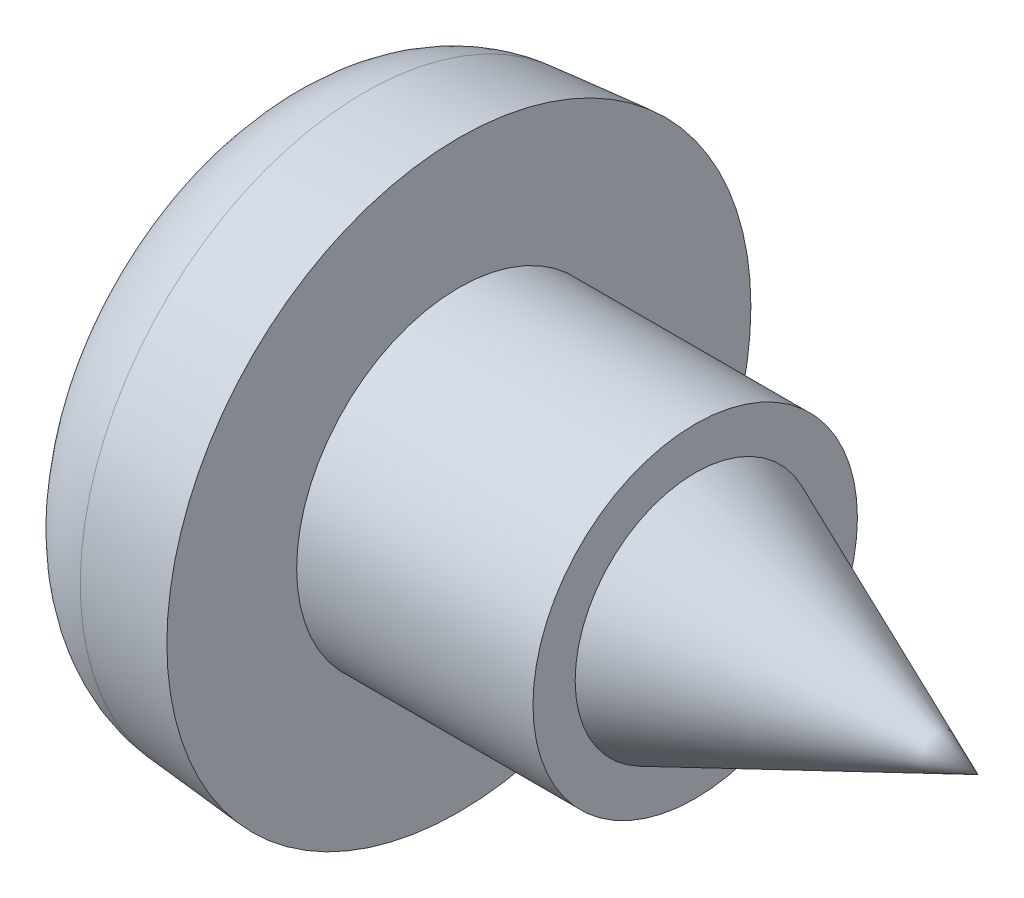
ISO-10303-21;
HEADER;
FILE_DESCRIPTION(('STEP AP214'),'2;1');
FILE_NAME('part.step','',(''),(''),'','','');
FILE_SCHEMA(('AUTOMOTIVE_DESIGN { 1 0 10303 214 1 1 1 1 }'));
ENDSEC;
DATA;
#1=APPLICATION_CONTEXT('core data for automotive mechanical design processes');
#2=APPLICATION_PROTOCOL_DEFINITION('international standard','automotive_design',2000,#1);
#3=PRODUCT_CONTEXT('',#1,'mechanical');
#4=PRODUCT('Part','Part','',(#3));
#5=PRODUCT_RELATED_PRODUCT_CATEGORY('part','',(#4));
#6=PRODUCT_DEFINITION_FORMATION('','',#4);
#7=PRODUCT_DEFINITION_CONTEXT('part definition',#1,'design');
#8=PRODUCT_DEFINITION('design','',#6,#7);
#9=PRODUCT_DEFINITION_SHAPE('','',#8);
#10=(LENGTH_UNIT() NAMED_UNIT(*) SI_UNIT(.MILLI.,.METRE.));
#11=(NAMED_UNIT(*) PLANE_ANGLE_UNIT() SI_UNIT($,.RADIAN.));
#12=(NAMED_UNIT(*) SI_UNIT($,.STERADIAN.) SOLID_ANGLE_UNIT());
#13=UNCERTAINTY_MEASURE_WITH_UNIT(LENGTH_MEASURE(1.E-05),#10,'distance_accuracy_value','');
#14=(GEOMETRIC_REPRESENTATION_CONTEXT(3) GLOBAL_UNCERTAINTY_ASSIGNED_CONTEXT((#13)) GLOBAL_UNIT_ASSIGNED_CONTEXT((#10,
#11,#12)) REPRESENTATION_CONTEXT('',''));
#15=CARTESIAN_POINT('',(0.,0.,0.));
#16=DIRECTION('',(0.,0.,1.));
#17=DIRECTION('',(1.,0.,0.));
#18=AXIS2_PLACEMENT_3D('',#15,#16,#17);
#19=CARTESIAN_POINT('',(8.71430910683078,0.,0.));
#20=DIRECTION('',(-1.,0.,0.));
#21=DIRECTION('',(0.,1.,0.));
#22=AXIS2_PLACEMENT_3D('',#19,#20,#21);
#23=SPHERICAL_SURFACE('',#22,12.0143091068308);
#24=CARTESIAN_POINT('',(-2.86461995912679,0.,0.));
#25=DIRECTION('',(-1.,0.,0.));
#26=DIRECTION('',(0.,-1.,0.));
#27=AXIS2_PLACEMENT_3D('',#24,#25,#26);
#28=CIRCLE('',#27,3.205);
#29=CARTESIAN_POINT('',(-2.86461995912679,-3.205,0.));
#30=VERTEX_POINT('',#29);
#31=EDGE_CURVE('E200',#30,#30,#28,.T.);
#32=ORIENTED_EDGE('',*,*,#31,.T.);
#33=EDGE_LOOP('',(#32));
#34=FACE_BOUND('',#33,.T.);
#35=CARTESIAN_POINT('',(8.71430910683078,0.,0.6));
#36=DIRECTION('',(0.,0.,-1.));
#37=DIRECTION('',(0.,1.,0.));
#38=AXIS2_PLACEMENT_3D('',#35,#36,#37);
#39=CIRCLE('',#38,11.9993176187014);
#40=CARTESIAN_POINT('',(-3.19088401694831,1.5,0.6));
#41=VERTEX_POINT('',#40);
#42=CARTESIAN_POINT('',(-3.03222754507122,2.45,0.6));
#43=VERTEX_POINT('',#42);
#44=EDGE_CURVE('E11',#41,#43,#39,.T.);
#45=ORIENTED_EDGE('',*,*,#44,.F.);
#46=CARTESIAN_POINT('',(-3.19085881503451,0.600000022222222,1.5002));
#47=CARTESIAN_POINT('',(-3.19717240021516,0.599944734246533,1.45014526895655));
#48=CARTESIAN_POINT('',(-3.20295251184894,0.604151437411233,1.40002361712067));
#49=CARTESIAN_POINT('',(-3.21330282557359,0.620840534157111,1.30106750971077));
#50=CARTESIAN_POINT('',(-3.21787345646741,0.633319989245332,1.25223260348464));
#51=CARTESIAN_POINT('',(-3.22566973273479,0.66632016780765,1.15719444171774));
#52=CARTESIAN_POINT('',(-3.2288942692566,0.686847493871419,1.11099338276246));
#53=CARTESIAN_POINT('',(-3.23389679913557,0.735372122855358,1.02262964181853));
#54=CARTESIAN_POINT('',(-3.23567528470542,0.763366879668487,0.980465590012011));
#55=CARTESIAN_POINT('',(-3.23772423786926,0.825776684300079,0.901731078441331));
#56=CARTESIAN_POINT('',(-3.2380072900193,0.860135627303679,0.865116466523264));
#57=CARTESIAN_POINT('',(-3.23709069611638,0.934451796124362,0.79810362632765));
#58=CARTESIAN_POINT('',(-3.23589083630782,0.974409828290752,0.767706294981509));
#59=CARTESIAN_POINT('',(-3.23205184363733,1.05860429914413,0.714091363648474));
#60=CARTESIAN_POINT('',(-3.2294180812834,1.10282426980992,0.690847476632724));
#61=CARTESIAN_POINT('',(-3.22279194359357,1.19440526484376,0.652012313699351));
#62=CARTESIAN_POINT('',(-3.2188000322867,1.24176521195475,0.636418428497995));
#63=CARTESIAN_POINT('',(-3.21089509556472,1.32447742653252,0.616568854951261));
#64=CARTESIAN_POINT('',(-3.20728437760876,1.35940133777345,0.610347785083807));
#65=CARTESIAN_POINT('',(-3.19948913356997,1.42962442311515,0.602058898418503));
#66=CARTESIAN_POINT('',(-3.19530543427538,1.46492299010207,0.599985163267821));
#67=CARTESIAN_POINT('',(-3.19085881503451,1.5002,0.600000022222223));
#68=B_SPLINE_CURVE_WITH_KNOTS('',3,(#46,#47,#48,#49,#50,#51,#52,#53,#54,#55,#56,#57,#58,#59,#60,
#61,#62,#63,#64,#65,#66,#67),.UNSPECIFIED.,.F.,.F.,(4,2,2,2,2,2,2,2,2,2,4),(0.,
0.151173776911939,0.302293885440135,0.45353823540821,0.604731082633738,0.754649542694306,
0.904589615400038,1.05397193090284,1.20330325918657,1.31003799133619,1.41662030129791),.UNSPECIFIED.);
#69=CARTESIAN_POINT('',(-3.19088401694831,0.6,1.5));
#70=VERTEX_POINT('',#69);
#71=EDGE_CURVE('E55',#70,#41,#68,.T.);
#72=ORIENTED_EDGE('',*,*,#71,.F.);
#73=CARTESIAN_POINT('',(8.71430910683078,0.6,0.));
#74=DIRECTION('',(0.,-1.,0.));
#75=DIRECTION('',(0.,0.,-1.));
#76=AXIS2_PLACEMENT_3D('',#73,#74,#75);
#77=CIRCLE('',#76,11.9993176187014);
#78=CARTESIAN_POINT('',(-3.03222754507122,0.6,2.45));
#79=VERTEX_POINT('',#78);
#80=EDGE_CURVE('E297',#79,#70,#77,.T.);
#81=ORIENTED_EDGE('',*,*,#80,.F.);
#82=CARTESIAN_POINT('',(8.71430910683078,0.,2.45));
#83=DIRECTION('',(0.,0.,-1.));
#84=DIRECTION('',(-1.,0.,0.));
#85=AXIS2_PLACEMENT_3D('',#82,#83,#84);
#86=CIRCLE('',#85,11.7618503354905);
#87=CARTESIAN_POINT('',(-3.03222754507122,-0.6,2.45));
#88=VERTEX_POINT('',#87);
#89=EDGE_CURVE('E298',#88,#79,#86,.T.);
#90=ORIENTED_EDGE('',*,*,#89,.F.);
#91=CARTESIAN_POINT('',(8.71430910683078,-0.600000000000002,0.));
#92=DIRECTION('',(0.,1.,0.));
#93=DIRECTION('',(0.,0.,1.));
#94=AXIS2_PLACEMENT_3D('',#91,#92,#93);
#95=CIRCLE('',#94,11.9993176187014);
#96=CARTESIAN_POINT('',(-3.19088401694831,-0.6,1.5));
#97=VERTEX_POINT('',#96);
#98=EDGE_CURVE('E267',#97,#88,#95,.T.);
#99=ORIENTED_EDGE('',*,*,#98,.F.);
#100=CARTESIAN_POINT('',(-3.19085881503451,-1.5002,0.600000022222223));
#101=CARTESIAN_POINT('',(-3.19717240021516,-1.45014526895655,0.599944734246533));
#102=CARTESIAN_POINT('',(-3.20295251184894,-1.40002361712067,0.604151437411234));
#103=CARTESIAN_POINT('',(-3.21330282557359,-1.30106750971077,0.620840534157112));
#104=CARTESIAN_POINT('',(-3.21787345646741,-1.25223260348464,0.633319989245333));
#105=CARTESIAN_POINT('',(-3.22566973273479,-1.15719444171774,0.666320167807651));
#106=CARTESIAN_POINT('',(-3.2288942692566,-1.11099338276246,0.68684749387142));
#107=CARTESIAN_POINT('',(-3.23389679913557,-1.02262964181853,0.735372122855359));
#108=CARTESIAN_POINT('',(-3.23567528470542,-0.980465590012011,0.763366879668488));
#109=CARTESIAN_POINT('',(-3.23772423786926,-0.901731078441331,0.82577668430008));
#110=CARTESIAN_POINT('',(-3.23800729001929,-0.865116466523264,0.86013562730368));
#111=CARTESIAN_POINT('',(-3.23709069611638,-0.79810362632765,0.934451796124363));
#112=CARTESIAN_POINT('',(-3.23589083630782,-0.767706294981509,0.974409828290753));
#113=CARTESIAN_POINT('',(-3.23205184363733,-0.714091363648474,1.05860429914413));
#114=CARTESIAN_POINT('',(-3.2294180812834,-0.690847476632724,1.10282426980993));
#115=CARTESIAN_POINT('',(-3.22279194359357,-0.652012313699351,1.19440526484376));
#116=CARTESIAN_POINT('',(-3.2188000322867,-0.636418428497995,1.24176521195475));
#117=CARTESIAN_POINT('',(-3.21089509556472,-0.616568854951261,1.32447742653252));
#118=CARTESIAN_POINT('',(-3.20728437760876,-0.610347785083807,1.35940133777345));
#119=CARTESIAN_POINT('',(-3.19948913356997,-0.602058898418503,1.42962442311515));
#120=CARTESIAN_POINT('',(-3.19530543427538,-0.599985163267821,1.46492299010207));
#121=CARTESIAN_POINT('',(-3.19085881503451,-0.600000022222223,1.5002));
#122=B_SPLINE_CURVE_WITH_KNOTS('',3,(#100,#101,#102,#103,#104,#105,#106,#107,#108,#109,#110,
#111,#112,#113,#114,#115,#116,#117,#118,#119,#120,#121),.UNSPECIFIED.,.F.,.F.,(4,2,2,2,2,2,2,2,
2,2,4),(0.,0.151173776911939,0.302293885440135,0.45353823540821,0.604731082633738,
0.754649542694306,0.904589615400038,1.05397193090284,1.20330325918657,1.31003799133619,
1.41662030129791),.UNSPECIFIED.);
#123=CARTESIAN_POINT('',(-3.19088401694831,-1.5,0.6));
#124=VERTEX_POINT('',#123);
#125=EDGE_CURVE('E260',#124,#97,#122,.T.);
#126=ORIENTED_EDGE('',*,*,#125,.F.);
#127=CARTESIAN_POINT('',(8.71430910683078,0.,0.6));
#128=DIRECTION('',(0.,0.,-1.));
#129=DIRECTION('',(0.,1.,0.));
#130=AXIS2_PLACEMENT_3D('',#127,#128,#129);
#131=CIRCLE('',#130,11.9993176187014);
#132=CARTESIAN_POINT('',(-3.03222754507122,-2.45,0.6));
#133=VERTEX_POINT('',#132);
#134=EDGE_CURVE('E258',#133,#124,#131,.T.);
#135=ORIENTED_EDGE('',*,*,#134,.F.);
#136=CARTESIAN_POINT('',(8.71430910683078,-2.45,0.));
#137=DIRECTION('',(0.,1.,0.));
#138=DIRECTION('',(0.,0.,1.));
#139=AXIS2_PLACEMENT_3D('',#136,#137,#138);
#140=CIRCLE('',#139,11.7618503354905);
#141=CARTESIAN_POINT('',(-3.03222754507122,-2.45,-0.600000000000001));
#142=VERTEX_POINT('',#141);
#143=EDGE_CURVE('E256',#142,#133,#140,.T.);
#144=ORIENTED_EDGE('',*,*,#143,.F.);
#145=CARTESIAN_POINT('',(8.71430910683078,0.,-0.599999999999999));
#146=DIRECTION('',(0.,0.,1.));
#147=DIRECTION('',(0.,-1.,0.));
#148=AXIS2_PLACEMENT_3D('',#145,#146,#147);
#149=CIRCLE('',#148,11.9993176187014);
#150=CARTESIAN_POINT('',(-3.19088401694831,-1.5,-0.6));
#151=VERTEX_POINT('',#150);
#152=EDGE_CURVE('E253',#151,#142,#149,.T.);
#153=ORIENTED_EDGE('',*,*,#152,.F.);
#154=CARTESIAN_POINT('',(-3.19085881503451,-0.600000022222223,-1.5002));
#155=CARTESIAN_POINT('',(-3.19717240021516,-0.599944734246533,-1.45014526895655));
#156=CARTESIAN_POINT('',(-3.20295251184894,-0.604151437411233,-1.40002361712067));
#157=CARTESIAN_POINT('',(-3.21330282557359,-0.620840534157112,-1.30106750971077));
#158=CARTESIAN_POINT('',(-3.21787345646741,-0.633319989245332,-1.25223260348464));
#159=CARTESIAN_POINT('',(-3.22566973273479,-0.666320167807651,-1.15719444171774));
#160=CARTESIAN_POINT('',(-3.2288942692566,-0.686847493871419,-1.11099338276246));
#161=CARTESIAN_POINT('',(-3.23389679913557,-0.735372122855358,-1.02262964181853));
#162=CARTESIAN_POINT('',(-3.23567528470542,-0.763366879668487,-0.980465590012011));
#163=CARTESIAN_POINT('',(-3.23772423786926,-0.825776684300079,-0.901731078441332));
#164=CARTESIAN_POINT('',(-3.2380072900193,-0.86013562730368,-0.865116466523265));
#165=CARTESIAN_POINT('',(-3.23709069611638,-0.934451796124362,-0.79810362632765));
#166=CARTESIAN_POINT('',(-3.23589083630782,-0.974409828290752,-0.767706294981509));
#167=CARTESIAN_POINT('',(-3.23205184363733,-1.05860429914413,-0.714091363648474));
#168=CARTESIAN_POINT('',(-3.2294180812834,-1.10282426980992,-0.690847476632724));
#169=CARTESIAN_POINT('',(-3.22279194359357,-1.19440526484376,-0.652012313699351));
#170=CARTESIAN_POINT('',(-3.2188000322867,-1.24176521195475,-0.636418428497995));
#171=CARTESIAN_POINT('',(-3.21089509556472,-1.32447742653252,-0.616568854951261));
#172=CARTESIAN_POINT('',(-3.20728437760876,-1.35940133777345,-0.610347785083807));
#173=CARTESIAN_POINT('',(-3.19948913356997,-1.42962442311515,-0.602058898418503));
#174=CARTESIAN_POINT('',(-3.19530543427538,-1.46492299010207,-0.599985163267821));
#175=CARTESIAN_POINT('',(-3.19085881503451,-1.5002,-0.600000022222223));
#176=B_SPLINE_CURVE_WITH_KNOTS('',3,(#154,#155,#156,#157,#158,#159,#160,#161,#162,#163,#164,
#165,#166,#167,#168,#169,#170,#171,#172,#173,#174,#175),.UNSPECIFIED.,.F.,.F.,(4,2,2,2,2,2,2,2,
2,2,4),(0.,0.151173776911938,0.302293885440135,0.45353823540821,0.604731082633738,
0.754649542694306,0.904589615400038,1.05397193090284,1.20330325918657,1.31003799133619,
1.41662030129791),.UNSPECIFIED.);
#177=CARTESIAN_POINT('',(-3.19088401694831,-0.600000000000001,-1.5));
#178=VERTEX_POINT('',#177);
#179=EDGE_CURVE('E246',#178,#151,#176,.T.);
#180=ORIENTED_EDGE('',*,*,#179,.F.);
#181=CARTESIAN_POINT('',(8.71430910683078,-0.600000000000001,0.));
#182=DIRECTION('',(0.,1.,0.));
#183=DIRECTION('',(0.,0.,1.));
#184=AXIS2_PLACEMENT_3D('',#181,#182,#183);
#185=CIRCLE('',#184,11.9993176187014);
#186=CARTESIAN_POINT('',(-3.03222754507122,-0.6,-2.45));
#187=VERTEX_POINT('',#186);
#188=EDGE_CURVE('E254',#187,#178,#185,.T.);
#189=ORIENTED_EDGE('',*,*,#188,.F.);
#190=CARTESIAN_POINT('',(8.71430910683078,0.,-2.45));
#191=DIRECTION('',(0.,0.,1.));
#192=DIRECTION('',(1.,0.,0.));
#193=AXIS2_PLACEMENT_3D('',#190,#191,#192);
#194=CIRCLE('',#193,11.7618503354905);
#195=CARTESIAN_POINT('',(-3.03222754507122,0.6,-2.45));
#196=VERTEX_POINT('',#195);
#197=EDGE_CURVE('E398',#196,#187,#194,.T.);
#198=ORIENTED_EDGE('',*,*,#197,.F.);
#199=CARTESIAN_POINT('',(8.71430910683078,0.600000000000001,0.));
#200=DIRECTION('',(0.,-1.,0.));
#201=DIRECTION('',(0.,0.,-1.));
#202=AXIS2_PLACEMENT_3D('',#199,#200,#201);
#203=CIRCLE('',#202,11.9993176187014);
#204=CARTESIAN_POINT('',(-3.19088401694831,0.6,-1.5));
#205=VERTEX_POINT('',#204);
#206=EDGE_CURVE('E214',#205,#196,#203,.T.);
#207=ORIENTED_EDGE('',*,*,#206,.F.);
#208=CARTESIAN_POINT('',(-3.19085881503451,1.5002,-0.600000022222223));
#209=CARTESIAN_POINT('',(-3.19717240021516,1.45014526895655,-0.599944734246533));
#210=CARTESIAN_POINT('',(-3.20295251184894,1.40002361712067,-0.604151437411233));
#211=CARTESIAN_POINT('',(-3.21330282557359,1.30106750971077,-0.620840534157112));
#212=CARTESIAN_POINT('',(-3.21787345646741,1.25223260348464,-0.633319989245332));
#213=CARTESIAN_POINT('',(-3.22566973273479,1.15719444171774,-0.666320167807651));
#214=CARTESIAN_POINT('',(-3.2288942692566,1.11099338276246,-0.686847493871419));
#215=CARTESIAN_POINT('',(-3.23389679913557,1.02262964181853,-0.735372122855358));
#216=CARTESIAN_POINT('',(-3.23567528470542,0.980465590012011,-0.763366879668487));
#217=CARTESIAN_POINT('',(-3.23772423786926,0.901731078441331,-0.82577668430008));
#218=CARTESIAN_POINT('',(-3.2380072900193,0.865116466523264,-0.86013562730368));
#219=CARTESIAN_POINT('',(-3.23709069611638,0.798103626327649,-0.934451796124363));
#220=CARTESIAN_POINT('',(-3.23589083630782,0.767706294981509,-0.974409828290753));
#221=CARTESIAN_POINT('',(-3.23205184363733,0.714091363648473,-1.05860429914413));
#222=CARTESIAN_POINT('',(-3.2294180812834,0.690847476632723,-1.10282426980993));
#223=CARTESIAN_POINT('',(-3.22279194359357,0.65201231369935,-1.19440526484376));
#224=CARTESIAN_POINT('',(-3.2188000322867,0.636418428497995,-1.24176521195475));
#225=CARTESIAN_POINT('',(-3.21089509556472,0.616568854951261,-1.32447742653253));
#226=CARTESIAN_POINT('',(-3.20728437760876,0.610347785083807,-1.35940133777346));
#227=CARTESIAN_POINT('',(-3.19948913356997,0.602058898418503,-1.42962442311515));
#228=CARTESIAN_POINT('',(-3.19530543427538,0.599985163267821,-1.46492299010207));
#229=CARTESIAN_POINT('',(-3.19085881503451,0.600000022222223,-1.5002));
#230=B_SPLINE_CURVE_WITH_KNOTS('',3,(#208,#209,#210,#211,#212,#213,#214,#215,#216,#217,#218,
#219,#220,#221,#222,#223,#224,#225,#226,#227,#228,#229),.UNSPECIFIED.,.F.,.F.,(4,2,2,2,2,2,2,2,
2,2,4),(0.,0.151173776911939,0.302293885440135,0.45353823540821,0.604731082633739,
0.754649542694306,0.904589615400038,1.05397193090284,1.20330325918657,1.31003799133619,
1.41662030129791),.UNSPECIFIED.);
#231=CARTESIAN_POINT('',(-3.19088401694831,1.5,-0.6));
#232=VERTEX_POINT('',#231);
#233=EDGE_CURVE('E207',#232,#205,#230,.T.);
#234=ORIENTED_EDGE('',*,*,#233,.F.);
#235=CARTESIAN_POINT('',(8.71430910683078,0.,-0.6));
#236=DIRECTION('',(0.,0.,1.));
#237=DIRECTION('',(0.,-1.,0.));
#238=AXIS2_PLACEMENT_3D('',#235,#236,#237);
#239=CIRCLE('',#238,11.9993176187014);
#240=CARTESIAN_POINT('',(-3.03222754507122,2.45,-0.6));
#241=VERTEX_POINT('',#240);
#242=EDGE_CURVE('E205',#241,#232,#239,.T.);
#243=ORIENTED_EDGE('',*,*,#242,.F.);
#244=CARTESIAN_POINT('',(8.71430910683078,2.45,0.));
#245=DIRECTION('',(0.,-1.,0.));
#246=DIRECTION('',(0.,0.,-1.));
#247=AXIS2_PLACEMENT_3D('',#244,#245,#246);
#248=CIRCLE('',#247,11.7618503354905);
#249=EDGE_CURVE('E203',#43,#241,#248,.T.);
#250=ORIENTED_EDGE('',*,*,#249,.F.);
#251=EDGE_LOOP('',(#45,#72,#81,#90,#99,#126,#135,#144,#153,#180,#189,#198,#207,#234,#243,#250));
#252=FACE_BOUND('',#251,.T.);
#253=ADVANCED_FACE('F47',(#34,#252),#23,.T.);
#254=CARTESIAN_POINT('',(-1.32260149258019,0.,0.));
#255=DIRECTION('',(-1.,0.,0.));
#256=DIRECTION('',(0.,-1.,0.));
#257=AXIS2_PLACEMENT_3D('',#254,#255,#256);
#258=TOROIDAL_SURFACE('',#257,2.77817562296741,1.6);
#259=ORIENTED_EDGE('',*,*,#31,.F.);
#260=EDGE_LOOP('',(#259));
#261=FACE_BOUND('',#260,.T.);
#262=CARTESIAN_POINT('',(-1.46205068097644,0.,0.));
#263=DIRECTION('',(-1.,0.,0.));
#264=DIRECTION('',(0.,-1.,0.));
#265=AXIS2_PLACEMENT_3D('',#262,#263,#264);
#266=CIRCLE('',#265,4.3720871399142);
#267=CARTESIAN_POINT('',(-1.46205068097644,-4.3720871399142,0.));
#268=VERTEX_POINT('',#267);
#269=EDGE_CURVE('E179',#268,#268,#266,.T.);
#270=ORIENTED_EDGE('',*,*,#269,.T.);
#271=EDGE_LOOP('',(#270));
#272=FACE_BOUND('',#271,.T.);
#273=ADVANCED_FACE('F49',(#261,#272),#258,.T.);
#274=CARTESIAN_POINT('',(8.,0.,0.));
#275=DIRECTION('',(-1.,0.,0.));
#276=DIRECTION('',(0.,-1.,0.));
#277=AXIS2_PLACEMENT_3D('',#274,#275,#276);
#278=CONICAL_SURFACE('',#277,0.,0.401425727958697);
#279=CARTESIAN_POINT('',(3.64167312322607,0.,0.));
#280=DIRECTION('',(-1.,0.,0.));
#281=DIRECTION('',(0.,-1.,0.));
#282=AXIS2_PLACEMENT_3D('',#279,#280,#281);
#283=CIRCLE('',#282,1.85);
#284=CARTESIAN_POINT('',(3.64167312322607,-1.85,0.));
#285=VERTEX_POINT('',#284);
#286=EDGE_CURVE('E197',#285,#285,#283,.T.);
#287=ORIENTED_EDGE('',*,*,#286,.F.);
#288=EDGE_LOOP('',(#287));
#289=FACE_BOUND('',#288,.T.);
#290=CARTESIAN_POINT('',(8.,0.,0.));
#291=VERTEX_POINT('',#290);
#292=VERTEX_LOOP('',#291);
#293=FACE_BOUND('',#292,.T.);
#294=ADVANCED_FACE('F423',(#289,#293),#278,.T.);
#295=CARTESIAN_POINT('',(3.64167312322607,2.5,0.));
#296=DIRECTION('',(-1.,0.,0.));
#297=DIRECTION('',(0.,-1.,0.));
#298=AXIS2_PLACEMENT_3D('',#295,#296,#297);
#299=PLANE('',#298);
#300=CARTESIAN_POINT('',(3.64167312322607,0.,0.));
#301=DIRECTION('',(-1.,0.,0.));
#302=DIRECTION('',(0.,-1.,0.));
#303=AXIS2_PLACEMENT_3D('',#300,#301,#302);
#304=CIRCLE('',#303,2.5);
#305=CARTESIAN_POINT('',(3.64167312322607,-2.5,0.));
#306=VERTEX_POINT('',#305);
#307=EDGE_CURVE('E194',#306,#306,#304,.T.);
#308=ORIENTED_EDGE('',*,*,#307,.F.);
#309=EDGE_LOOP('',(#308));
#310=FACE_BOUND('',#309,.T.);
#311=ORIENTED_EDGE('',*,*,#286,.T.);
#312=EDGE_LOOP('',(#311));
#313=FACE_BOUND('',#312,.T.);
#314=ADVANCED_FACE('F442',(#310,#313),#299,.F.);
#315=CARTESIAN_POINT('',(-3.3,0.,0.));
#316=DIRECTION('',(-1.,0.,0.));
#317=DIRECTION('',(0.,-1.,0.));
#318=AXIS2_PLACEMENT_3D('',#315,#316,#317);
#319=CYLINDRICAL_SURFACE('',#318,2.5);
#320=CARTESIAN_POINT('',(0.,0.,0.));
#321=DIRECTION('',(-1.,0.,0.));
#322=DIRECTION('',(0.,-1.,0.));
#323=AXIS2_PLACEMENT_3D('',#320,#321,#322);
#324=CIRCLE('',#323,2.5);
#325=CARTESIAN_POINT('',(0.,-2.5,0.));
#326=VERTEX_POINT('',#325);
#327=EDGE_CURVE('E191',#326,#326,#324,.T.);
#328=ORIENTED_EDGE('',*,*,#327,.F.);
#329=EDGE_LOOP('',(#328));
#330=FACE_BOUND('',#329,.T.);
#331=ORIENTED_EDGE('',*,*,#307,.T.);
#332=EDGE_LOOP('',(#331));
#333=FACE_BOUND('',#332,.T.);
#334=ADVANCED_FACE('F436',(#330,#333),#319,.T.);
#335=CARTESIAN_POINT('',(0.,4.5,0.));
#336=DIRECTION('',(-1.,0.,0.));
#337=DIRECTION('',(0.,-1.,0.));
#338=AXIS2_PLACEMENT_3D('',#335,#336,#337);
#339=PLANE('',#338);
#340=CARTESIAN_POINT('',(0.,0.,0.));
#341=DIRECTION('',(-1.,0.,0.));
#342=DIRECTION('',(0.,-1.,0.));
#343=AXIS2_PLACEMENT_3D('',#340,#341,#342);
#344=CIRCLE('',#343,4.5);
#345=CARTESIAN_POINT('',(0.,-4.5,0.));
#346=VERTEX_POINT('',#345);
#347=EDGE_CURVE('E183',#346,#346,#344,.T.);
#348=ORIENTED_EDGE('',*,*,#347,.F.);
#349=EDGE_LOOP('',(#348));
#350=FACE_BOUND('',#349,.T.);
#351=ORIENTED_EDGE('',*,*,#327,.T.);
#352=EDGE_LOOP('',(#351));
#353=FACE_BOUND('',#352,.T.);
#354=ADVANCED_FACE('F431',(#350,#353),#339,.F.);
#355=CARTESIAN_POINT('',(0.,0.,0.));
#356=DIRECTION('',(1.,0.,0.));
#357=DIRECTION('',(0.,1.,0.));
#358=AXIS2_PLACEMENT_3D('',#355,#356,#357);
#359=CONICAL_SURFACE('',#358,4.5,0.0872664625997173);
#360=ORIENTED_EDGE('',*,*,#269,.F.);
#361=EDGE_LOOP('',(#360));
#362=FACE_BOUND('',#361,.T.);
#363=ORIENTED_EDGE('',*,*,#347,.T.);
#364=EDGE_LOOP('',(#363));
#365=FACE_BOUND('',#364,.T.);
#366=ADVANCED_FACE('F429',(#362,#365),#359,.T.);
#367=CARTESIAN_POINT('',(-1.65,1.5,0.6));
#368=DIRECTION('',(0.,0.,-1.));
#369=DIRECTION('',(0.,1.,0.));
#370=AXIS2_PLACEMENT_3D('',#367,#368,#369);
#371=PLANE('',#370);
#372=ORIENTED_EDGE('',*,*,#44,.T.);
#373=DIRECTION('',(-1.,0.,0.));
#374=VECTOR('',#373,1.);
#375=CARTESIAN_POINT('',(-1.65,2.45,0.6));
#376=LINE('',#375,#374);
#377=CARTESIAN_POINT('',(-1.65,2.45,0.6));
#378=VERTEX_POINT('',#377);
#379=EDGE_CURVE('E62',#378,#43,#376,.T.);
#380=ORIENTED_EDGE('',*,*,#379,.F.);
#381=DIRECTION('',(0.,-1.,0.));
#382=VECTOR('',#381,1.);
#383=CARTESIAN_POINT('',(-1.65,1.5,0.6));
#384=LINE('',#383,#382);
#385=CARTESIAN_POINT('',(-1.65,1.5,0.6));
#386=VERTEX_POINT('',#385);
#387=EDGE_CURVE('E163',#378,#386,#384,.T.);
#388=ORIENTED_EDGE('',*,*,#387,.T.);
#389=DIRECTION('',(-1.,0.,0.));
#390=VECTOR('',#389,1.);
#391=CARTESIAN_POINT('',(-1.65,1.5,0.6));
#392=LINE('',#391,#390);
#393=EDGE_CURVE('E174',#386,#41,#392,.T.);
#394=ORIENTED_EDGE('',*,*,#393,.T.);
#395=EDGE_LOOP('',(#372,#380,#388,#394));
#396=FACE_BOUND('',#395,.T.);
#397=ADVANCED_FACE('F173',(#396),#371,.T.);
#398=CARTESIAN_POINT('',(-1.65,1.5,1.5));
#399=DIRECTION('',(-1.,0.,0.));
#400=DIRECTION('',(0.,0.,1.));
#401=AXIS2_PLACEMENT_3D('',#398,#399,#400);
#402=CYLINDRICAL_SURFACE('',#401,0.9);
#403=ORIENTED_EDGE('',*,*,#71,.T.);
#404=ORIENTED_EDGE('',*,*,#393,.F.);
#405=CARTESIAN_POINT('',(-1.65,1.5,1.5));
#406=DIRECTION('',(-1.,0.,0.));
#407=DIRECTION('',(0.,0.,-1.));
#408=AXIS2_PLACEMENT_3D('',#405,#406,#407);
#409=CIRCLE('',#408,0.9);
#410=CARTESIAN_POINT('',(-1.65,0.6,1.5));
#411=VERTEX_POINT('',#410);
#412=EDGE_CURVE('E159',#386,#411,#409,.T.);
#413=ORIENTED_EDGE('',*,*,#412,.T.);
#414=DIRECTION('',(-1.,0.,0.));
#415=VECTOR('',#414,1.);
#416=CARTESIAN_POINT('',(-1.65,0.6,1.5));
#417=LINE('',#416,#415);
#418=EDGE_CURVE('E180',#411,#70,#417,.T.);
#419=ORIENTED_EDGE('',*,*,#418,.T.);
#420=EDGE_LOOP('',(#403,#404,#413,#419));
#421=FACE_BOUND('',#420,.T.);
#422=ADVANCED_FACE('F177',(#421),#402,.T.);
#423=CARTESIAN_POINT('',(-1.65,0.6,1.5));
#424=DIRECTION('',(0.,-1.,0.));
#425=DIRECTION('',(0.,0.,-1.));
#426=AXIS2_PLACEMENT_3D('',#423,#424,#425);
#427=PLANE('',#426);
#428=ORIENTED_EDGE('',*,*,#80,.T.);
#429=ORIENTED_EDGE('',*,*,#418,.F.);
#430=DIRECTION('',(0.,0.,1.));
#431=VECTOR('',#430,1.);
#432=CARTESIAN_POINT('',(-1.65,0.6,1.5));
#433=LINE('',#432,#431);
#434=CARTESIAN_POINT('',(-1.65,0.6,2.45));
#435=VERTEX_POINT('',#434);
#436=EDGE_CURVE('E165',#411,#435,#433,.T.);
#437=ORIENTED_EDGE('',*,*,#436,.T.);
#438=DIRECTION('',(-1.,0.,0.));
#439=VECTOR('',#438,1.);
#440=CARTESIAN_POINT('',(-1.65,0.6,2.45));
#441=LINE('',#440,#439);
#442=EDGE_CURVE('E185',#435,#79,#441,.T.);
#443=ORIENTED_EDGE('',*,*,#442,.T.);
#444=EDGE_LOOP('',(#428,#429,#437,#443));
#445=FACE_BOUND('',#444,.T.);
#446=ADVANCED_FACE('F283',(#445),#427,.T.);
#447=CARTESIAN_POINT('',(-1.65,0.6,2.45));
#448=DIRECTION('',(0.,0.,-1.));
#449=DIRECTION('',(-1.,0.,0.));
#450=AXIS2_PLACEMENT_3D('',#447,#448,#449);
#451=PLANE('',#450);
#452=ORIENTED_EDGE('',*,*,#89,.T.);
#453=ORIENTED_EDGE('',*,*,#442,.F.);
#454=DIRECTION('',(0.,-1.,0.));
#455=VECTOR('',#454,1.);
#456=CARTESIAN_POINT('',(-1.65,0.6,2.45));
#457=LINE('',#456,#455);
#458=CARTESIAN_POINT('',(-1.65,-0.6,2.45));
#459=VERTEX_POINT('',#458);
#460=EDGE_CURVE('E312',#435,#459,#457,.T.);
#461=ORIENTED_EDGE('',*,*,#460,.T.);
#462=DIRECTION('',(-1.,0.,0.));
#463=VECTOR('',#462,1.);
#464=CARTESIAN_POINT('',(-1.65,-0.6,2.45));
#465=LINE('',#464,#463);
#466=EDGE_CURVE('E306',#459,#88,#465,.T.);
#467=ORIENTED_EDGE('',*,*,#466,.T.);
#468=EDGE_LOOP('',(#452,#453,#461,#467));
#469=FACE_BOUND('',#468,.T.);
#470=ADVANCED_FACE('F279',(#469),#451,.T.);
#471=CARTESIAN_POINT('',(-1.65,-0.600000000000001,1.5));
#472=DIRECTION('',(0.,1.,0.));
#473=DIRECTION('',(0.,0.,1.));
#474=AXIS2_PLACEMENT_3D('',#471,#472,#473);
#475=PLANE('',#474);
#476=ORIENTED_EDGE('',*,*,#98,.T.);
#477=ORIENTED_EDGE('',*,*,#466,.F.);
#478=DIRECTION('',(0.,0.,-1.));
#479=VECTOR('',#478,1.);
#480=CARTESIAN_POINT('',(-1.65,-0.600000000000001,1.5));
#481=LINE('',#480,#479);
#482=CARTESIAN_POINT('',(-1.65,-0.6,1.5));
#483=VERTEX_POINT('',#482);
#484=EDGE_CURVE('E370',#459,#483,#481,.T.);
#485=ORIENTED_EDGE('',*,*,#484,.T.);
#486=DIRECTION('',(-1.,0.,0.));
#487=VECTOR('',#486,1.);
#488=CARTESIAN_POINT('',(-1.65,-0.6,1.5));
#489=LINE('',#488,#487);
#490=EDGE_CURVE('E309',#483,#97,#489,.T.);
#491=ORIENTED_EDGE('',*,*,#490,.T.);
#492=EDGE_LOOP('',(#476,#477,#485,#491));
#493=FACE_BOUND('',#492,.T.);
#494=ADVANCED_FACE('F275',(#493),#475,.T.);
#495=CARTESIAN_POINT('',(-1.65,-1.5,1.5));
#496=DIRECTION('',(-1.,0.,0.));
#497=DIRECTION('',(0.,0.,1.));
#498=AXIS2_PLACEMENT_3D('',#495,#496,#497);
#499=CYLINDRICAL_SURFACE('',#498,0.9);
#500=ORIENTED_EDGE('',*,*,#125,.T.);
#501=ORIENTED_EDGE('',*,*,#490,.F.);
#502=CARTESIAN_POINT('',(-1.65,-1.5,1.5));
#503=DIRECTION('',(-1.,0.,0.));
#504=DIRECTION('',(0.,0.,1.));
#505=AXIS2_PLACEMENT_3D('',#502,#503,#504);
#506=CIRCLE('',#505,0.9);
#507=CARTESIAN_POINT('',(-1.65,-1.5,0.6));
#508=VERTEX_POINT('',#507);
#509=EDGE_CURVE('E368',#483,#508,#506,.T.);
#510=ORIENTED_EDGE('',*,*,#509,.T.);
#511=DIRECTION('',(-1.,0.,0.));
#512=VECTOR('',#511,1.);
#513=CARTESIAN_POINT('',(-1.65,-1.5,0.6));
#514=LINE('',#513,#512);
#515=EDGE_CURVE('E317',#508,#124,#514,.T.);
#516=ORIENTED_EDGE('',*,*,#515,.T.);
#517=EDGE_LOOP('',(#500,#501,#510,#516));
#518=FACE_BOUND('',#517,.T.);
#519=ADVANCED_FACE('F269',(#518),#499,.T.);
#520=CARTESIAN_POINT('',(-1.65,-1.5,0.6));
#521=DIRECTION('',(0.,0.,-1.));
#522=DIRECTION('',(0.,1.,0.));
#523=AXIS2_PLACEMENT_3D('',#520,#521,#522);
#524=PLANE('',#523);
#525=ORIENTED_EDGE('',*,*,#134,.T.);
#526=ORIENTED_EDGE('',*,*,#515,.F.);
#527=DIRECTION('',(0.,-1.,0.));
#528=VECTOR('',#527,1.);
#529=CARTESIAN_POINT('',(-1.65,-1.5,0.6));
#530=LINE('',#529,#528);
#531=CARTESIAN_POINT('',(-1.65,-2.45,0.6));
#532=VERTEX_POINT('',#531);
#533=EDGE_CURVE('E366',#508,#532,#530,.T.);
#534=ORIENTED_EDGE('',*,*,#533,.T.);
#535=DIRECTION('',(-1.,0.,0.));
#536=VECTOR('',#535,1.);
#537=CARTESIAN_POINT('',(-1.65,-2.45,0.6));
#538=LINE('',#537,#536);
#539=EDGE_CURVE('E320',#532,#133,#538,.T.);
#540=ORIENTED_EDGE('',*,*,#539,.T.);
#541=EDGE_LOOP('',(#525,#526,#534,#540));
#542=FACE_BOUND('',#541,.T.);
#543=ADVANCED_FACE('F274',(#542),#524,.T.);
#544=CARTESIAN_POINT('',(-1.65,-2.45,-0.600000000000001));
#545=DIRECTION('',(0.,1.,0.));
#546=DIRECTION('',(0.,0.,1.));
#547=AXIS2_PLACEMENT_3D('',#544,#545,#546);
#548=PLANE('',#547);
#549=ORIENTED_EDGE('',*,*,#143,.T.);
#550=ORIENTED_EDGE('',*,*,#539,.F.);
#551=DIRECTION('',(0.,0.,-1.));
#552=VECTOR('',#551,1.);
#553=CARTESIAN_POINT('',(-1.65,-2.45,-0.600000000000001));
#554=LINE('',#553,#552);
#555=CARTESIAN_POINT('',(-1.65,-2.45,-0.600000000000001));
#556=VERTEX_POINT('',#555);
#557=EDGE_CURVE('E364',#532,#556,#554,.T.);
#558=ORIENTED_EDGE('',*,*,#557,.T.);
#559=DIRECTION('',(-1.,0.,0.));
#560=VECTOR('',#559,1.);
#561=CARTESIAN_POINT('',(-1.65,-2.45,-0.600000000000001));
#562=LINE('',#561,#560);
#563=EDGE_CURVE('E323',#556,#142,#562,.T.);
#564=ORIENTED_EDGE('',*,*,#563,.T.);
#565=EDGE_LOOP('',(#549,#550,#558,#564));
#566=FACE_BOUND('',#565,.T.);
#567=ADVANCED_FACE('F382',(#566),#548,.T.);
#568=CARTESIAN_POINT('',(-1.65,-1.5,-0.6));
#569=DIRECTION('',(0.,0.,1.));
#570=DIRECTION('',(0.,-1.,0.));
#571=AXIS2_PLACEMENT_3D('',#568,#569,#570);
#572=PLANE('',#571);
#573=ORIENTED_EDGE('',*,*,#152,.T.);
#574=ORIENTED_EDGE('',*,*,#563,.F.);
#575=DIRECTION('',(0.,1.,0.));
#576=VECTOR('',#575,1.);
#577=CARTESIAN_POINT('',(-1.65,-1.5,-0.6));
#578=LINE('',#577,#576);
#579=CARTESIAN_POINT('',(-1.65,-1.5,-0.6));
#580=VERTEX_POINT('',#579);
#581=EDGE_CURVE('E362',#556,#580,#578,.T.);
#582=ORIENTED_EDGE('',*,*,#581,.T.);
#583=DIRECTION('',(-1.,0.,0.));
#584=VECTOR('',#583,1.);
#585=CARTESIAN_POINT('',(-1.65,-1.5,-0.6));
#586=LINE('',#585,#584);
#587=EDGE_CURVE('E326',#580,#151,#586,.T.);
#588=ORIENTED_EDGE('',*,*,#587,.T.);
#589=EDGE_LOOP('',(#573,#574,#582,#588));
#590=FACE_BOUND('',#589,.T.);
#591=ADVANCED_FACE('F242',(#590),#572,.T.);
#592=CARTESIAN_POINT('',(-1.65,-1.5,-1.5));
#593=DIRECTION('',(-1.,0.,0.));
#594=DIRECTION('',(0.,0.,1.));
#595=AXIS2_PLACEMENT_3D('',#592,#593,#594);
#596=CYLINDRICAL_SURFACE('',#595,0.9);
#597=ORIENTED_EDGE('',*,*,#179,.T.);
#598=ORIENTED_EDGE('',*,*,#587,.F.);
#599=CARTESIAN_POINT('',(-1.65,-1.5,-1.5));
#600=DIRECTION('',(-1.,0.,0.));
#601=DIRECTION('',(0.,0.,1.));
#602=AXIS2_PLACEMENT_3D('',#599,#600,#601);
#603=CIRCLE('',#602,0.9);
#604=CARTESIAN_POINT('',(-1.65,-0.600000000000001,-1.5));
#605=VERTEX_POINT('',#604);
#606=EDGE_CURVE('E360',#580,#605,#603,.T.);
#607=ORIENTED_EDGE('',*,*,#606,.T.);
#608=DIRECTION('',(-1.,0.,0.));
#609=VECTOR('',#608,1.);
#610=CARTESIAN_POINT('',(-1.65,-0.600000000000001,-1.5));
#611=LINE('',#610,#609);
#612=EDGE_CURVE('E329',#605,#178,#611,.T.);
#613=ORIENTED_EDGE('',*,*,#612,.T.);
#614=EDGE_LOOP('',(#597,#598,#607,#613));
#615=FACE_BOUND('',#614,.T.);
#616=ADVANCED_FACE('F237',(#615),#596,.T.);
#617=CARTESIAN_POINT('',(-1.65,-0.6,-2.45));
#618=DIRECTION('',(0.,1.,0.));
#619=DIRECTION('',(0.,0.,1.));
#620=AXIS2_PLACEMENT_3D('',#617,#618,#619);
#621=PLANE('',#620);
#622=ORIENTED_EDGE('',*,*,#188,.T.);
#623=ORIENTED_EDGE('',*,*,#612,.F.);
#624=DIRECTION('',(0.,0.,-1.));
#625=VECTOR('',#624,1.);
#626=CARTESIAN_POINT('',(-1.65,-0.6,-2.45));
#627=LINE('',#626,#625);
#628=CARTESIAN_POINT('',(-1.65,-0.6,-2.45));
#629=VERTEX_POINT('',#628);
#630=EDGE_CURVE('E358',#605,#629,#627,.T.);
#631=ORIENTED_EDGE('',*,*,#630,.T.);
#632=DIRECTION('',(-1.,0.,0.));
#633=VECTOR('',#632,1.);
#634=CARTESIAN_POINT('',(-1.65,-0.6,-2.45));
#635=LINE('',#634,#633);
#636=EDGE_CURVE('E332',#629,#187,#635,.T.);
#637=ORIENTED_EDGE('',*,*,#636,.T.);
#638=EDGE_LOOP('',(#622,#623,#631,#637));
#639=FACE_BOUND('',#638,.T.);
#640=ADVANCED_FACE('F233',(#639),#621,.T.);
#641=CARTESIAN_POINT('',(-1.65,0.6,-2.45));
#642=DIRECTION('',(0.,0.,1.));
#643=DIRECTION('',(1.,0.,0.));
#644=AXIS2_PLACEMENT_3D('',#641,#642,#643);
#645=PLANE('',#644);
#646=ORIENTED_EDGE('',*,*,#197,.T.);
#647=ORIENTED_EDGE('',*,*,#636,.F.);
#648=DIRECTION('',(0.,1.,0.));
#649=VECTOR('',#648,1.);
#650=CARTESIAN_POINT('',(-1.65,0.6,-2.45));
#651=LINE('',#650,#649);
#652=CARTESIAN_POINT('',(-1.65,0.6,-2.45));
#653=VERTEX_POINT('',#652);
#654=EDGE_CURVE('E356',#629,#653,#651,.T.);
#655=ORIENTED_EDGE('',*,*,#654,.T.);
#656=DIRECTION('',(-1.,0.,0.));
#657=VECTOR('',#656,1.);
#658=CARTESIAN_POINT('',(-1.65,0.6,-2.45));
#659=LINE('',#658,#657);
#660=EDGE_CURVE('E335',#653,#196,#659,.T.);
#661=ORIENTED_EDGE('',*,*,#660,.T.);
#662=EDGE_LOOP('',(#646,#647,#655,#661));
#663=FACE_BOUND('',#662,.T.);
#664=ADVANCED_FACE('F229',(#663),#645,.T.);
#665=CARTESIAN_POINT('',(-1.65,0.6,-2.45));
#666=DIRECTION('',(0.,-1.,0.));
#667=DIRECTION('',(0.,0.,-1.));
#668=AXIS2_PLACEMENT_3D('',#665,#666,#667);
#669=PLANE('',#668);
#670=ORIENTED_EDGE('',*,*,#206,.T.);
#671=ORIENTED_EDGE('',*,*,#660,.F.);
#672=DIRECTION('',(0.,0.,1.));
#673=VECTOR('',#672,1.);
#674=CARTESIAN_POINT('',(-1.65,0.6,-2.45));
#675=LINE('',#674,#673);
#676=CARTESIAN_POINT('',(-1.65,0.6,-1.5));
#677=VERTEX_POINT('',#676);
#678=EDGE_CURVE('E354',#653,#677,#675,.T.);
#679=ORIENTED_EDGE('',*,*,#678,.T.);
#680=DIRECTION('',(-1.,0.,0.));
#681=VECTOR('',#680,1.);
#682=CARTESIAN_POINT('',(-1.65,0.6,-1.5));
#683=LINE('',#682,#681);
#684=EDGE_CURVE('E338',#677,#205,#683,.T.);
#685=ORIENTED_EDGE('',*,*,#684,.T.);
#686=EDGE_LOOP('',(#670,#671,#679,#685));
#687=FACE_BOUND('',#686,.T.);
#688=ADVANCED_FACE('F224',(#687),#669,.T.);
#689=CARTESIAN_POINT('',(-1.65,1.5,-1.5));
#690=DIRECTION('',(-1.,0.,0.));
#691=DIRECTION('',(0.,0.,1.));
#692=AXIS2_PLACEMENT_3D('',#689,#690,#691);
#693=CYLINDRICAL_SURFACE('',#692,0.9);
#694=ORIENTED_EDGE('',*,*,#233,.T.);
#695=ORIENTED_EDGE('',*,*,#684,.F.);
#696=CARTESIAN_POINT('',(-1.65,1.5,-1.5));
#697=DIRECTION('',(-1.,0.,0.));
#698=DIRECTION('',(0.,0.,-1.));
#699=AXIS2_PLACEMENT_3D('',#696,#697,#698);
#700=CIRCLE('',#699,0.9);
#701=CARTESIAN_POINT('',(-1.65,1.5,-0.6));
#702=VERTEX_POINT('',#701);
#703=EDGE_CURVE('E352',#677,#702,#700,.T.);
#704=ORIENTED_EDGE('',*,*,#703,.T.);
#705=DIRECTION('',(-1.,0.,0.));
#706=VECTOR('',#705,1.);
#707=CARTESIAN_POINT('',(-1.65,1.5,-0.6));
#708=LINE('',#707,#706);
#709=EDGE_CURVE('E341',#702,#232,#708,.T.);
#710=ORIENTED_EDGE('',*,*,#709,.T.);
#711=EDGE_LOOP('',(#694,#695,#704,#710));
#712=FACE_BOUND('',#711,.T.);
#713=ADVANCED_FACE('F218',(#712),#693,.T.);
#714=CARTESIAN_POINT('',(-1.65,1.5,-0.6));
#715=DIRECTION('',(0.,0.,1.));
#716=DIRECTION('',(0.,-1.,0.));
#717=AXIS2_PLACEMENT_3D('',#714,#715,#716);
#718=PLANE('',#717);
#719=ORIENTED_EDGE('',*,*,#242,.T.);
#720=ORIENTED_EDGE('',*,*,#709,.F.);
#721=DIRECTION('',(0.,1.,0.));
#722=VECTOR('',#721,1.);
#723=CARTESIAN_POINT('',(-1.65,1.5,-0.6));
#724=LINE('',#723,#722);
#725=CARTESIAN_POINT('',(-1.65,2.45,-0.6));
#726=VERTEX_POINT('',#725);
#727=EDGE_CURVE('E350',#702,#726,#724,.T.);
#728=ORIENTED_EDGE('',*,*,#727,.T.);
#729=DIRECTION('',(-1.,0.,0.));
#730=VECTOR('',#729,1.);
#731=CARTESIAN_POINT('',(-1.65,2.45,-0.6));
#732=LINE('',#731,#730);
#733=EDGE_CURVE('E344',#726,#241,#732,.T.);
#734=ORIENTED_EDGE('',*,*,#733,.T.);
#735=EDGE_LOOP('',(#719,#720,#728,#734));
#736=FACE_BOUND('',#735,.T.);
#737=ADVANCED_FACE('F223',(#736),#718,.T.);
#738=CARTESIAN_POINT('',(-1.65,2.45,-0.6));
#739=DIRECTION('',(0.,-1.,0.));
#740=DIRECTION('',(0.,0.,-1.));
#741=AXIS2_PLACEMENT_3D('',#738,#739,#740);
#742=PLANE('',#741);
#743=ORIENTED_EDGE('',*,*,#249,.T.);
#744=ORIENTED_EDGE('',*,*,#733,.F.);
#745=DIRECTION('',(0.,0.,1.));
#746=VECTOR('',#745,1.);
#747=CARTESIAN_POINT('',(-1.65,2.45,-0.6));
#748=LINE('',#747,#746);
#749=EDGE_CURVE('E348',#726,#378,#748,.T.);
#750=ORIENTED_EDGE('',*,*,#749,.T.);
#751=ORIENTED_EDGE('',*,*,#379,.T.);
#752=EDGE_LOOP('',(#743,#744,#750,#751));
#753=FACE_BOUND('',#752,.T.);
#754=ADVANCED_FACE('F409',(#753),#742,.T.);
#755=CARTESIAN_POINT('',(-1.65,1.5,-1.5));
#756=DIRECTION('',(1.,0.,0.));
#757=DIRECTION('',(0.,0.,-1.));
#758=AXIS2_PLACEMENT_3D('',#755,#756,#757);
#759=PLANE('',#758);
#760=ORIENTED_EDGE('',*,*,#387,.F.);
#761=ORIENTED_EDGE('',*,*,#749,.F.);
#762=ORIENTED_EDGE('',*,*,#727,.F.);
#763=ORIENTED_EDGE('',*,*,#703,.F.);
#764=ORIENTED_EDGE('',*,*,#678,.F.);
#765=ORIENTED_EDGE('',*,*,#654,.F.);
#766=ORIENTED_EDGE('',*,*,#630,.F.);
#767=ORIENTED_EDGE('',*,*,#606,.F.);
#768=ORIENTED_EDGE('',*,*,#581,.F.);
#769=ORIENTED_EDGE('',*,*,#557,.F.);
#770=ORIENTED_EDGE('',*,*,#533,.F.);
#771=ORIENTED_EDGE('',*,*,#509,.F.);
#772=ORIENTED_EDGE('',*,*,#484,.F.);
#773=ORIENTED_EDGE('',*,*,#460,.F.);
#774=ORIENTED_EDGE('',*,*,#436,.F.);
#775=ORIENTED_EDGE('',*,*,#412,.F.);
#776=EDGE_LOOP('',(#760,#761,#762,#763,#764,#765,#766,#767,#768,#769,#770,#771,#772,#773,#774,#775));
#777=FACE_BOUND('',#776,.T.);
#778=ADVANCED_FACE('F161',(#777),#759,.F.);
#779=CLOSED_SHELL('',(#253,#273,#294,#314,#334,#354,#366,#397,#422,#446,#470,#494,#519,#543,
#567,#591,#616,#640,#664,#688,#713,#737,#754,#778));
#780=MANIFOLD_SOLID_BREP('B2',#779);
#781=ADVANCED_BREP_SHAPE_REPRESENTATION('',(#18,#780),#14);
#782=SHAPE_DEFINITION_REPRESENTATION(#9,#781);
ENDSEC;
END-ISO-10303-21;
